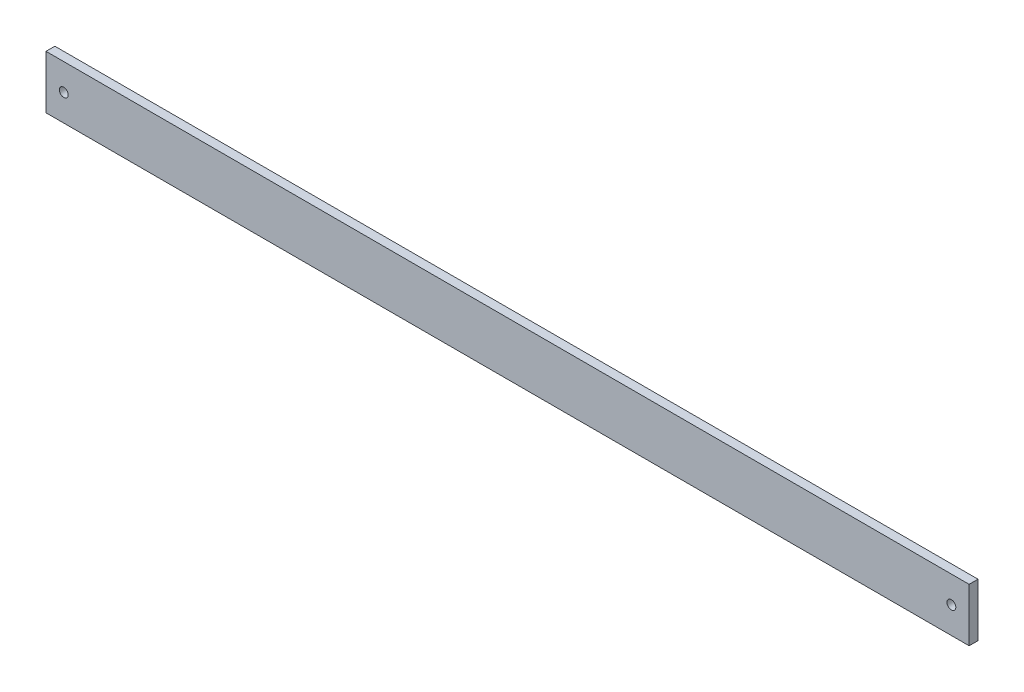
ISO-10303-21;
HEADER;
FILE_DESCRIPTION(('STEP AP214'),'2;1');
FILE_NAME('part.step','',(''),(''),'','','');
FILE_SCHEMA(('AUTOMOTIVE_DESIGN { 1 0 10303 214 1 1 1 1 }'));
ENDSEC;
DATA;
#1=APPLICATION_CONTEXT('core data for automotive mechanical design processes');
#2=APPLICATION_PROTOCOL_DEFINITION('international standard','automotive_design',2000,#1);
#3=PRODUCT_CONTEXT('',#1,'mechanical');
#4=PRODUCT('Part','Part','',(#3));
#5=PRODUCT_RELATED_PRODUCT_CATEGORY('part','',(#4));
#6=PRODUCT_DEFINITION_FORMATION('','',#4);
#7=PRODUCT_DEFINITION_CONTEXT('part definition',#1,'design');
#8=PRODUCT_DEFINITION('design','',#6,#7);
#9=PRODUCT_DEFINITION_SHAPE('','',#8);
#10=(LENGTH_UNIT() NAMED_UNIT(*) SI_UNIT(.MILLI.,.METRE.));
#11=(NAMED_UNIT(*) PLANE_ANGLE_UNIT() SI_UNIT($,.RADIAN.));
#12=(NAMED_UNIT(*) SI_UNIT($,.STERADIAN.) SOLID_ANGLE_UNIT());
#13=UNCERTAINTY_MEASURE_WITH_UNIT(LENGTH_MEASURE(1.E-05),#10,'distance_accuracy_value','');
#14=(GEOMETRIC_REPRESENTATION_CONTEXT(3) GLOBAL_UNCERTAINTY_ASSIGNED_CONTEXT((#13)) GLOBAL_UNIT_ASSIGNED_CONTEXT((#10,
#11,#12)) REPRESENTATION_CONTEXT('',''));
#15=CARTESIAN_POINT('',(0.,0.,0.));
#16=DIRECTION('',(0.,0.,1.));
#17=DIRECTION('',(1.,0.,0.));
#18=AXIS2_PLACEMENT_3D('',#15,#16,#17);
#19=CARTESIAN_POINT('',(0.,0.,3.175));
#20=DIRECTION('',(0.,0.,-1.));
#21=DIRECTION('',(-1.,0.,0.));
#22=AXIS2_PLACEMENT_3D('',#19,#20,#21);
#23=PLANE('',#22);
#24=DIRECTION('',(0.,-1.,0.));
#25=VECTOR('',#24,1.);
#26=CARTESIAN_POINT('',(0.,0.,3.175));
#27=LINE('',#26,#25);
#28=CARTESIAN_POINT('',(0.,19.05,3.175));
#29=VERTEX_POINT('',#28);
#30=CARTESIAN_POINT('',(0.,0.,3.175));
#31=VERTEX_POINT('',#30);
#32=EDGE_CURVE('E89',#29,#31,#27,.T.);
#33=ORIENTED_EDGE('',*,*,#32,.T.);
#34=DIRECTION('',(1.,0.,0.));
#35=VECTOR('',#34,1.);
#36=CARTESIAN_POINT('',(0.,0.,3.175));
#37=LINE('',#36,#35);
#38=CARTESIAN_POINT('',(330.2,0.,3.175));
#39=VERTEX_POINT('',#38);
#40=EDGE_CURVE('E84',#31,#39,#37,.T.);
#41=ORIENTED_EDGE('',*,*,#40,.T.);
#42=DIRECTION('',(0.,1.,0.));
#43=VECTOR('',#42,1.);
#44=CARTESIAN_POINT('',(330.2,0.,3.175));
#45=LINE('',#44,#43);
#46=CARTESIAN_POINT('',(330.2,19.05,3.175));
#47=VERTEX_POINT('',#46);
#48=EDGE_CURVE('E87',#39,#47,#45,.T.);
#49=ORIENTED_EDGE('',*,*,#48,.T.);
#50=DIRECTION('',(-1.,0.,0.));
#51=VECTOR('',#50,1.);
#52=CARTESIAN_POINT('',(0.,19.05,3.175));
#53=LINE('',#52,#51);
#54=EDGE_CURVE('E54',#47,#29,#53,.T.);
#55=ORIENTED_EDGE('',*,*,#54,.T.);
#56=EDGE_LOOP('',(#33,#41,#49,#55));
#57=FACE_BOUND('',#56,.T.);
#58=CARTESIAN_POINT('',(6.35,9.525,3.175));
#59=DIRECTION('',(0.,0.,1.));
#60=DIRECTION('',(1.,0.,0.));
#61=AXIS2_PLACEMENT_3D('',#58,#59,#60);
#62=CIRCLE('',#61,1.5875);
#63=CARTESIAN_POINT('',(7.9375,9.525,3.175));
#64=VERTEX_POINT('',#63);
#65=EDGE_CURVE('E104',#64,#64,#62,.T.);
#66=ORIENTED_EDGE('',*,*,#65,.F.);
#67=EDGE_LOOP('',(#66));
#68=FACE_BOUND('',#67,.T.);
#69=CARTESIAN_POINT('',(323.85,9.525,3.175));
#70=DIRECTION('',(0.,0.,1.));
#71=DIRECTION('',(1.,0.,0.));
#72=AXIS2_PLACEMENT_3D('',#69,#70,#71);
#73=CIRCLE('',#72,1.58750000000004);
#74=CARTESIAN_POINT('',(325.4375,9.525,3.175));
#75=VERTEX_POINT('',#74);
#76=EDGE_CURVE('E119',#75,#75,#73,.T.);
#77=ORIENTED_EDGE('',*,*,#76,.F.);
#78=EDGE_LOOP('',(#77));
#79=FACE_BOUND('',#78,.T.);
#80=ADVANCED_FACE('F37',(#57,#68,#79),#23,.F.);
#81=CARTESIAN_POINT('',(0.,0.,0.));
#82=DIRECTION('',(0.,0.,-1.));
#83=DIRECTION('',(-1.,0.,0.));
#84=AXIS2_PLACEMENT_3D('',#81,#82,#83);
#85=PLANE('',#84);
#86=CARTESIAN_POINT('',(6.35,9.525,0.));
#87=DIRECTION('',(0.,0.,1.));
#88=DIRECTION('',(1.,0.,0.));
#89=AXIS2_PLACEMENT_3D('',#86,#87,#88);
#90=CIRCLE('',#89,1.5875);
#91=CARTESIAN_POINT('',(7.9375,9.525,0.));
#92=VERTEX_POINT('',#91);
#93=EDGE_CURVE('E116',#92,#92,#90,.T.);
#94=ORIENTED_EDGE('',*,*,#93,.T.);
#95=EDGE_LOOP('',(#94));
#96=FACE_BOUND('',#95,.T.);
#97=DIRECTION('',(0.,-1.,0.));
#98=VECTOR('',#97,1.);
#99=CARTESIAN_POINT('',(0.,0.,0.));
#100=LINE('',#99,#98);
#101=CARTESIAN_POINT('',(0.,19.05,0.));
#102=VERTEX_POINT('',#101);
#103=CARTESIAN_POINT('',(0.,0.,0.));
#104=VERTEX_POINT('',#103);
#105=EDGE_CURVE('E101',#102,#104,#100,.T.);
#106=ORIENTED_EDGE('',*,*,#105,.F.);
#107=DIRECTION('',(-1.,0.,0.));
#108=VECTOR('',#107,1.);
#109=CARTESIAN_POINT('',(0.,19.05,0.));
#110=LINE('',#109,#108);
#111=CARTESIAN_POINT('',(330.2,19.05,0.));
#112=VERTEX_POINT('',#111);
#113=EDGE_CURVE('E77',#112,#102,#110,.T.);
#114=ORIENTED_EDGE('',*,*,#113,.F.);
#115=DIRECTION('',(0.,1.,0.));
#116=VECTOR('',#115,1.);
#117=CARTESIAN_POINT('',(330.2,0.,0.));
#118=LINE('',#117,#116);
#119=CARTESIAN_POINT('',(330.2,0.,0.));
#120=VERTEX_POINT('',#119);
#121=EDGE_CURVE('E71',#120,#112,#118,.T.);
#122=ORIENTED_EDGE('',*,*,#121,.F.);
#123=DIRECTION('',(1.,0.,0.));
#124=VECTOR('',#123,1.);
#125=CARTESIAN_POINT('',(0.,0.,0.));
#126=LINE('',#125,#124);
#127=EDGE_CURVE('E93',#104,#120,#126,.T.);
#128=ORIENTED_EDGE('',*,*,#127,.F.);
#129=EDGE_LOOP('',(#106,#114,#122,#128));
#130=FACE_BOUND('',#129,.T.);
#131=CARTESIAN_POINT('',(323.85,9.525,0.));
#132=DIRECTION('',(0.,0.,1.));
#133=DIRECTION('',(1.,0.,0.));
#134=AXIS2_PLACEMENT_3D('',#131,#132,#133);
#135=CIRCLE('',#134,1.58750000000004);
#136=CARTESIAN_POINT('',(325.4375,9.525,0.));
#137=VERTEX_POINT('',#136);
#138=EDGE_CURVE('E122',#137,#137,#135,.T.);
#139=ORIENTED_EDGE('',*,*,#138,.T.);
#140=EDGE_LOOP('',(#139));
#141=FACE_BOUND('',#140,.T.);
#142=ADVANCED_FACE('F112',(#96,#130,#141),#85,.T.);
#143=CARTESIAN_POINT('',(0.,0.,3.175));
#144=DIRECTION('',(1.,0.,0.));
#145=DIRECTION('',(0.,0.,-1.));
#146=AXIS2_PLACEMENT_3D('',#143,#144,#145);
#147=PLANE('',#146);
#148=ORIENTED_EDGE('',*,*,#105,.T.);
#149=DIRECTION('',(0.,0.,-1.));
#150=VECTOR('',#149,1.);
#151=CARTESIAN_POINT('',(0.,0.,3.175));
#152=LINE('',#151,#150);
#153=EDGE_CURVE('E11',#31,#104,#152,.T.);
#154=ORIENTED_EDGE('',*,*,#153,.F.);
#155=ORIENTED_EDGE('',*,*,#32,.F.);
#156=DIRECTION('',(0.,0.,-1.));
#157=VECTOR('',#156,1.);
#158=CARTESIAN_POINT('',(0.,19.05,3.175));
#159=LINE('',#158,#157);
#160=EDGE_CURVE('E97',#29,#102,#159,.T.);
#161=ORIENTED_EDGE('',*,*,#160,.T.);
#162=EDGE_LOOP('',(#148,#154,#155,#161));
#163=FACE_BOUND('',#162,.T.);
#164=ADVANCED_FACE('F39',(#163),#147,.F.);
#165=CARTESIAN_POINT('',(0.,0.,3.175));
#166=DIRECTION('',(0.,1.,0.));
#167=DIRECTION('',(0.,0.,1.));
#168=AXIS2_PLACEMENT_3D('',#165,#166,#167);
#169=PLANE('',#168);
#170=ORIENTED_EDGE('',*,*,#127,.T.);
#171=DIRECTION('',(0.,0.,-1.));
#172=VECTOR('',#171,1.);
#173=CARTESIAN_POINT('',(330.2,0.,3.175));
#174=LINE('',#173,#172);
#175=EDGE_CURVE('E46',#39,#120,#174,.T.);
#176=ORIENTED_EDGE('',*,*,#175,.F.);
#177=ORIENTED_EDGE('',*,*,#40,.F.);
#178=ORIENTED_EDGE('',*,*,#153,.T.);
#179=EDGE_LOOP('',(#170,#176,#177,#178));
#180=FACE_BOUND('',#179,.T.);
#181=ADVANCED_FACE('F92',(#180),#169,.F.);
#182=CARTESIAN_POINT('',(330.2,0.,3.175));
#183=DIRECTION('',(-1.,0.,0.));
#184=DIRECTION('',(0.,0.,1.));
#185=AXIS2_PLACEMENT_3D('',#182,#183,#184);
#186=PLANE('',#185);
#187=ORIENTED_EDGE('',*,*,#121,.T.);
#188=DIRECTION('',(0.,0.,-1.));
#189=VECTOR('',#188,1.);
#190=CARTESIAN_POINT('',(330.2,19.05,3.175));
#191=LINE('',#190,#189);
#192=EDGE_CURVE('E94',#47,#112,#191,.T.);
#193=ORIENTED_EDGE('',*,*,#192,.F.);
#194=ORIENTED_EDGE('',*,*,#48,.F.);
#195=ORIENTED_EDGE('',*,*,#175,.T.);
#196=EDGE_LOOP('',(#187,#193,#194,#195));
#197=FACE_BOUND('',#196,.T.);
#198=ADVANCED_FACE('F95',(#197),#186,.F.);
#199=CARTESIAN_POINT('',(0.,19.05,3.175));
#200=DIRECTION('',(0.,-1.,0.));
#201=DIRECTION('',(0.,0.,-1.));
#202=AXIS2_PLACEMENT_3D('',#199,#200,#201);
#203=PLANE('',#202);
#204=ORIENTED_EDGE('',*,*,#113,.T.);
#205=ORIENTED_EDGE('',*,*,#160,.F.);
#206=ORIENTED_EDGE('',*,*,#54,.F.);
#207=ORIENTED_EDGE('',*,*,#192,.T.);
#208=EDGE_LOOP('',(#204,#205,#206,#207));
#209=FACE_BOUND('',#208,.T.);
#210=ADVANCED_FACE('F109',(#209),#203,.F.);
#211=CARTESIAN_POINT('',(6.35,9.525,3.175));
#212=DIRECTION('',(0.,0.,-1.));
#213=DIRECTION('',(-1.,0.,0.));
#214=AXIS2_PLACEMENT_3D('',#211,#212,#213);
#215=CYLINDRICAL_SURFACE('',#214,1.5875);
#216=ORIENTED_EDGE('',*,*,#65,.T.);
#217=EDGE_LOOP('',(#216));
#218=FACE_BOUND('',#217,.T.);
#219=ORIENTED_EDGE('',*,*,#93,.F.);
#220=EDGE_LOOP('',(#219));
#221=FACE_BOUND('',#220,.T.);
#222=ADVANCED_FACE('F139',(#218,#221),#215,.F.);
#223=CARTESIAN_POINT('',(323.85,9.525,3.175));
#224=DIRECTION('',(0.,0.,-1.));
#225=DIRECTION('',(-1.,0.,0.));
#226=AXIS2_PLACEMENT_3D('',#223,#224,#225);
#227=CYLINDRICAL_SURFACE('',#226,1.58750000000004);
#228=ORIENTED_EDGE('',*,*,#76,.T.);
#229=EDGE_LOOP('',(#228));
#230=FACE_BOUND('',#229,.T.);
#231=ORIENTED_EDGE('',*,*,#138,.F.);
#232=EDGE_LOOP('',(#231));
#233=FACE_BOUND('',#232,.T.);
#234=ADVANCED_FACE('F128',(#230,#233),#227,.F.);
#235=CLOSED_SHELL('',(#80,#142,#164,#181,#198,#210,#222,#234));
#236=MANIFOLD_SOLID_BREP('B2',#235);
#237=ADVANCED_BREP_SHAPE_REPRESENTATION('',(#18,#236),#14);
#238=SHAPE_DEFINITION_REPRESENTATION(#9,#237);
ENDSEC;
END-ISO-10303-21;
